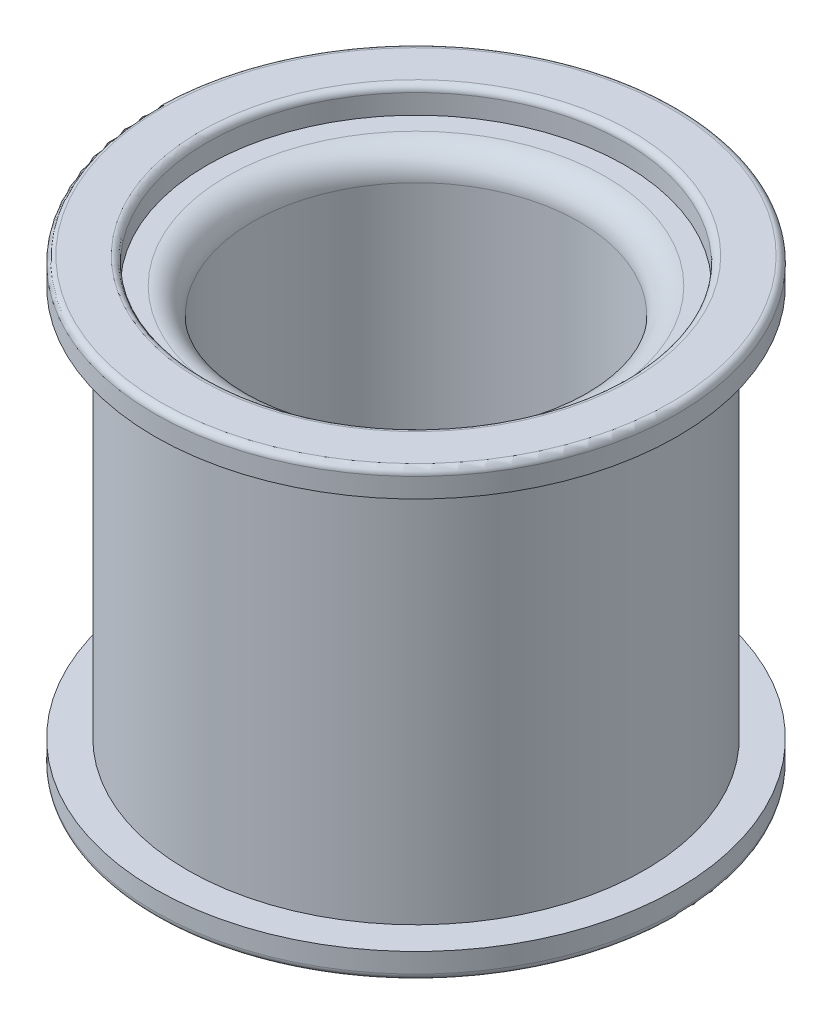
ISO-10303-21;
HEADER;
FILE_DESCRIPTION(('STEP AP214'),'2;1');
FILE_NAME('part.step','',(''),(''),'','','');
FILE_SCHEMA(('AUTOMOTIVE_DESIGN { 1 0 10303 214 1 1 1 1 }'));
ENDSEC;
DATA;
#1=APPLICATION_CONTEXT('core data for automotive mechanical design processes');
#2=APPLICATION_PROTOCOL_DEFINITION('international standard','automotive_design',2000,#1);
#3=PRODUCT_CONTEXT('',#1,'mechanical');
#4=PRODUCT('Part','Part','',(#3));
#5=PRODUCT_RELATED_PRODUCT_CATEGORY('part','',(#4));
#6=PRODUCT_DEFINITION_FORMATION('','',#4);
#7=PRODUCT_DEFINITION_CONTEXT('part definition',#1,'design');
#8=PRODUCT_DEFINITION('design','',#6,#7);
#9=PRODUCT_DEFINITION_SHAPE('','',#8);
#10=(LENGTH_UNIT() NAMED_UNIT(*) SI_UNIT(.MILLI.,.METRE.));
#11=(NAMED_UNIT(*) PLANE_ANGLE_UNIT() SI_UNIT($,.RADIAN.));
#12=(NAMED_UNIT(*) SI_UNIT($,.STERADIAN.) SOLID_ANGLE_UNIT());
#13=UNCERTAINTY_MEASURE_WITH_UNIT(LENGTH_MEASURE(1.E-05),#10,'distance_accuracy_value','');
#14=(GEOMETRIC_REPRESENTATION_CONTEXT(3) GLOBAL_UNCERTAINTY_ASSIGNED_CONTEXT((#13)) GLOBAL_UNIT_ASSIGNED_CONTEXT((#10,
#11,#12)) REPRESENTATION_CONTEXT('',''));
#15=CARTESIAN_POINT('',(0.,0.,0.));
#16=DIRECTION('',(0.,0.,1.));
#17=DIRECTION('',(1.,0.,0.));
#18=AXIS2_PLACEMENT_3D('',#15,#16,#17);
#19=CARTESIAN_POINT('',(0.,-17.,0.));
#20=DIRECTION('',(0.,-1.,0.));
#21=DIRECTION('',(0.,0.,-1.));
#22=AXIS2_PLACEMENT_3D('',#19,#20,#21);
#23=PLANE('',#22);
#24=CARTESIAN_POINT('',(0.,-17.,0.));
#25=DIRECTION('',(0.,-1.,0.));
#26=DIRECTION('',(0.,0.,-1.));
#27=AXIS2_PLACEMENT_3D('',#24,#25,#26);
#28=CIRCLE('',#27,19.5);
#29=CARTESIAN_POINT('',(0.,-17.,-19.5));
#30=VERTEX_POINT('',#29);
#31=EDGE_CURVE('E57',#30,#30,#28,.T.);
#32=ORIENTED_EDGE('',*,*,#31,.T.);
#33=EDGE_LOOP('',(#32));
#34=FACE_BOUND('',#33,.T.);
#35=CARTESIAN_POINT('',(0.,-17.,0.));
#36=DIRECTION('',(0.,-1.,0.));
#37=DIRECTION('',(0.,0.,-1.));
#38=AXIS2_PLACEMENT_3D('',#35,#36,#37);
#39=CIRCLE('',#38,16.5);
#40=CARTESIAN_POINT('',(0.,-17.,-16.5));
#41=VERTEX_POINT('',#40);
#42=EDGE_CURVE('E61',#41,#41,#39,.F.);
#43=ORIENTED_EDGE('',*,*,#42,.T.);
#44=EDGE_LOOP('',(#43));
#45=FACE_BOUND('',#44,.T.);
#46=ADVANCED_FACE('F46',(#34,#45),#23,.T.);
#47=CARTESIAN_POINT('',(0.,-15.,0.));
#48=DIRECTION('',(0.,-1.,0.));
#49=DIRECTION('',(0.,0.,-1.));
#50=AXIS2_PLACEMENT_3D('',#47,#48,#49);
#51=PLANE('',#50);
#52=CARTESIAN_POINT('',(0.,-15.,0.));
#53=DIRECTION('',(0.,-1.,0.));
#54=DIRECTION('',(0.,0.,-1.));
#55=AXIS2_PLACEMENT_3D('',#52,#53,#54);
#56=CIRCLE('',#55,20.);
#57=CARTESIAN_POINT('',(0.,-15.,-20.));
#58=VERTEX_POINT('',#57);
#59=EDGE_CURVE('E66',#58,#58,#56,.T.);
#60=ORIENTED_EDGE('',*,*,#59,.F.);
#61=EDGE_LOOP('',(#60));
#62=FACE_BOUND('',#61,.T.);
#63=CARTESIAN_POINT('',(0.,-15.,0.));
#64=DIRECTION('',(0.,-1.,0.));
#65=DIRECTION('',(0.,0.,-1.));
#66=AXIS2_PLACEMENT_3D('',#63,#64,#65);
#67=CIRCLE('',#66,16.);
#68=CARTESIAN_POINT('',(0.,-15.,-16.));
#69=VERTEX_POINT('',#68);
#70=EDGE_CURVE('E69',#69,#69,#67,.T.);
#71=ORIENTED_EDGE('',*,*,#70,.T.);
#72=EDGE_LOOP('',(#71));
#73=FACE_BOUND('',#72,.T.);
#74=ADVANCED_FACE('F73',(#62,#73),#51,.F.);
#75=CARTESIAN_POINT('',(0.,-17.,0.));
#76=DIRECTION('',(0.,1.,0.));
#77=DIRECTION('',(0.,0.,1.));
#78=AXIS2_PLACEMENT_3D('',#75,#76,#77);
#79=CYLINDRICAL_SURFACE('',#78,20.);
#80=CARTESIAN_POINT('',(0.,-16.5,0.));
#81=DIRECTION('',(0.,-1.,0.));
#82=DIRECTION('',(0.,0.,-1.));
#83=AXIS2_PLACEMENT_3D('',#80,#81,#82);
#84=CIRCLE('',#83,20.);
#85=CARTESIAN_POINT('',(0.,-16.5,-20.));
#86=VERTEX_POINT('',#85);
#87=EDGE_CURVE('E53',#86,#86,#84,.F.);
#88=ORIENTED_EDGE('',*,*,#87,.T.);
#89=EDGE_LOOP('',(#88));
#90=FACE_BOUND('',#89,.T.);
#91=ORIENTED_EDGE('',*,*,#59,.T.);
#92=EDGE_LOOP('',(#91));
#93=FACE_BOUND('',#92,.T.);
#94=ADVANCED_FACE('F78',(#90,#93),#79,.T.);
#95=CARTESIAN_POINT('',(0.,-17.,0.));
#96=DIRECTION('',(0.,1.,0.));
#97=DIRECTION('',(0.,0.,1.));
#98=AXIS2_PLACEMENT_3D('',#95,#96,#97);
#99=CYLINDRICAL_SURFACE('',#98,16.);
#100=CARTESIAN_POINT('',(0.,-16.5,0.));
#101=DIRECTION('',(0.,-1.,0.));
#102=DIRECTION('',(0.,0.,-1.));
#103=AXIS2_PLACEMENT_3D('',#100,#101,#102);
#104=CIRCLE('',#103,16.);
#105=CARTESIAN_POINT('',(0.,-16.5,-16.));
#106=VERTEX_POINT('',#105);
#107=EDGE_CURVE('E11',#106,#106,#104,.T.);
#108=ORIENTED_EDGE('',*,*,#107,.T.);
#109=EDGE_LOOP('',(#108));
#110=FACE_BOUND('',#109,.T.);
#111=ORIENTED_EDGE('',*,*,#70,.F.);
#112=EDGE_LOOP('',(#111));
#113=FACE_BOUND('',#112,.T.);
#114=ADVANCED_FACE('F75',(#110,#113),#99,.F.);
#115=CARTESIAN_POINT('',(0.,-16.5,0.));
#116=DIRECTION('',(0.,-1.,0.));
#117=DIRECTION('',(0.,0.,-1.));
#118=AXIS2_PLACEMENT_3D('',#115,#116,#117);
#119=TOROIDAL_SURFACE('',#118,19.5,0.5);
#120=ORIENTED_EDGE('',*,*,#87,.F.);
#121=EDGE_LOOP('',(#120));
#122=FACE_BOUND('',#121,.T.);
#123=ORIENTED_EDGE('',*,*,#31,.F.);
#124=EDGE_LOOP('',(#123));
#125=FACE_BOUND('',#124,.T.);
#126=ADVANCED_FACE('F77',(#122,#125),#119,.T.);
#127=CARTESIAN_POINT('',(0.,-16.5,0.));
#128=DIRECTION('',(0.,-1.,0.));
#129=DIRECTION('',(0.,0.,-1.));
#130=AXIS2_PLACEMENT_3D('',#127,#128,#129);
#131=TOROIDAL_SURFACE('',#130,16.5,0.5);
#132=ORIENTED_EDGE('',*,*,#42,.F.);
#133=EDGE_LOOP('',(#132));
#134=FACE_BOUND('',#133,.T.);
#135=ORIENTED_EDGE('',*,*,#107,.F.);
#136=EDGE_LOOP('',(#135));
#137=FACE_BOUND('',#136,.T.);
#138=ADVANCED_FACE('F48',(#134,#137),#131,.T.);
#139=CLOSED_SHELL('',(#46,#74,#94,#114,#126,#138));
#140=MANIFOLD_SOLID_BREP('B2',#139);
#141=CARTESIAN_POINT('',(0.,17.,0.));
#142=DIRECTION('',(0.,1.,0.));
#143=DIRECTION('',(0.,0.,1.));
#144=AXIS2_PLACEMENT_3D('',#141,#142,#143);
#145=PLANE('',#144);
#146=CARTESIAN_POINT('',(0.,17.,0.));
#147=DIRECTION('',(0.,1.,0.));
#148=DIRECTION('',(0.,0.,1.));
#149=AXIS2_PLACEMENT_3D('',#146,#147,#148);
#150=CIRCLE('',#149,19.5);
#151=CARTESIAN_POINT('',(0.,17.,19.5));
#152=VERTEX_POINT('',#151);
#153=EDGE_CURVE('E156',#152,#152,#150,.T.);
#154=ORIENTED_EDGE('',*,*,#153,.T.);
#155=EDGE_LOOP('',(#154));
#156=FACE_BOUND('',#155,.T.);
#157=CARTESIAN_POINT('',(0.,17.,0.));
#158=DIRECTION('',(0.,1.,0.));
#159=DIRECTION('',(0.,0.,1.));
#160=AXIS2_PLACEMENT_3D('',#157,#158,#159);
#161=CIRCLE('',#160,16.5);
#162=CARTESIAN_POINT('',(0.,17.,16.5));
#163=VERTEX_POINT('',#162);
#164=EDGE_CURVE('E160',#163,#163,#161,.F.);
#165=ORIENTED_EDGE('',*,*,#164,.T.);
#166=EDGE_LOOP('',(#165));
#167=FACE_BOUND('',#166,.T.);
#168=ADVANCED_FACE('F145',(#156,#167),#145,.T.);
#169=CARTESIAN_POINT('',(0.,15.,0.));
#170=DIRECTION('',(0.,1.,0.));
#171=DIRECTION('',(0.,0.,1.));
#172=AXIS2_PLACEMENT_3D('',#169,#170,#171);
#173=PLANE('',#172);
#174=CARTESIAN_POINT('',(0.,15.,0.));
#175=DIRECTION('',(0.,1.,0.));
#176=DIRECTION('',(0.,0.,1.));
#177=AXIS2_PLACEMENT_3D('',#174,#175,#176);
#178=CIRCLE('',#177,20.);
#179=CARTESIAN_POINT('',(0.,15.,20.));
#180=VERTEX_POINT('',#179);
#181=EDGE_CURVE('E165',#180,#180,#178,.T.);
#182=ORIENTED_EDGE('',*,*,#181,.F.);
#183=EDGE_LOOP('',(#182));
#184=FACE_BOUND('',#183,.T.);
#185=CARTESIAN_POINT('',(0.,15.,0.));
#186=DIRECTION('',(0.,1.,0.));
#187=DIRECTION('',(0.,0.,1.));
#188=AXIS2_PLACEMENT_3D('',#185,#186,#187);
#189=CIRCLE('',#188,16.);
#190=CARTESIAN_POINT('',(0.,15.,16.));
#191=VERTEX_POINT('',#190);
#192=EDGE_CURVE('E168',#191,#191,#189,.T.);
#193=ORIENTED_EDGE('',*,*,#192,.T.);
#194=EDGE_LOOP('',(#193));
#195=FACE_BOUND('',#194,.T.);
#196=ADVANCED_FACE('F172',(#184,#195),#173,.F.);
#197=CARTESIAN_POINT('',(0.,17.,0.));
#198=DIRECTION('',(0.,-1.,0.));
#199=DIRECTION('',(0.,0.,-1.));
#200=AXIS2_PLACEMENT_3D('',#197,#198,#199);
#201=CYLINDRICAL_SURFACE('',#200,20.);
#202=CARTESIAN_POINT('',(0.,16.5,0.));
#203=DIRECTION('',(0.,1.,0.));
#204=DIRECTION('',(0.,0.,1.));
#205=AXIS2_PLACEMENT_3D('',#202,#203,#204);
#206=CIRCLE('',#205,20.);
#207=CARTESIAN_POINT('',(0.,16.5,20.));
#208=VERTEX_POINT('',#207);
#209=EDGE_CURVE('E152',#208,#208,#206,.F.);
#210=ORIENTED_EDGE('',*,*,#209,.T.);
#211=EDGE_LOOP('',(#210));
#212=FACE_BOUND('',#211,.T.);
#213=ORIENTED_EDGE('',*,*,#181,.T.);
#214=EDGE_LOOP('',(#213));
#215=FACE_BOUND('',#214,.T.);
#216=ADVANCED_FACE('F177',(#212,#215),#201,.T.);
#217=CARTESIAN_POINT('',(0.,17.,0.));
#218=DIRECTION('',(0.,-1.,0.));
#219=DIRECTION('',(0.,0.,-1.));
#220=AXIS2_PLACEMENT_3D('',#217,#218,#219);
#221=CYLINDRICAL_SURFACE('',#220,16.);
#222=CARTESIAN_POINT('',(0.,16.5,0.));
#223=DIRECTION('',(0.,1.,0.));
#224=DIRECTION('',(0.,0.,1.));
#225=AXIS2_PLACEMENT_3D('',#222,#223,#224);
#226=CIRCLE('',#225,16.);
#227=CARTESIAN_POINT('',(0.,16.5,16.));
#228=VERTEX_POINT('',#227);
#229=EDGE_CURVE('E45',#228,#228,#226,.T.);
#230=ORIENTED_EDGE('',*,*,#229,.T.);
#231=EDGE_LOOP('',(#230));
#232=FACE_BOUND('',#231,.T.);
#233=ORIENTED_EDGE('',*,*,#192,.F.);
#234=EDGE_LOOP('',(#233));
#235=FACE_BOUND('',#234,.T.);
#236=ADVANCED_FACE('F174',(#232,#235),#221,.F.);
#237=CARTESIAN_POINT('',(0.,16.5,0.));
#238=DIRECTION('',(0.,1.,0.));
#239=DIRECTION('',(0.,0.,1.));
#240=AXIS2_PLACEMENT_3D('',#237,#238,#239);
#241=TOROIDAL_SURFACE('',#240,19.5,0.5);
#242=ORIENTED_EDGE('',*,*,#209,.F.);
#243=EDGE_LOOP('',(#242));
#244=FACE_BOUND('',#243,.T.);
#245=ORIENTED_EDGE('',*,*,#153,.F.);
#246=EDGE_LOOP('',(#245));
#247=FACE_BOUND('',#246,.T.);
#248=ADVANCED_FACE('F176',(#244,#247),#241,.T.);
#249=CARTESIAN_POINT('',(0.,16.5,0.));
#250=DIRECTION('',(0.,1.,0.));
#251=DIRECTION('',(0.,0.,1.));
#252=AXIS2_PLACEMENT_3D('',#249,#250,#251);
#253=TOROIDAL_SURFACE('',#252,16.5,0.5);
#254=ORIENTED_EDGE('',*,*,#164,.F.);
#255=EDGE_LOOP('',(#254));
#256=FACE_BOUND('',#255,.T.);
#257=ORIENTED_EDGE('',*,*,#229,.F.);
#258=EDGE_LOOP('',(#257));
#259=FACE_BOUND('',#258,.T.);
#260=ADVANCED_FACE('F147',(#256,#259),#253,.T.);
#261=CLOSED_SHELL('',(#168,#196,#216,#236,#248,#260));
#262=MANIFOLD_SOLID_BREP('B6',#261);
#263=CARTESIAN_POINT('',(0.,15.,0.));
#264=DIRECTION('',(0.,1.,0.));
#265=DIRECTION('',(0.,0.,1.));
#266=AXIS2_PLACEMENT_3D('',#263,#264,#265);
#267=PLANE('',#266);
#268=CARTESIAN_POINT('',(0.,15.,0.));
#269=DIRECTION('',(0.,1.,0.));
#270=DIRECTION('',(0.,0.,1.));
#271=AXIS2_PLACEMENT_3D('',#268,#269,#270);
#272=CIRCLE('',#271,14.5);
#273=CARTESIAN_POINT('',(0.,15.,14.5));
#274=VERTEX_POINT('',#273);
#275=EDGE_CURVE('E250',#274,#274,#272,.F.);
#276=ORIENTED_EDGE('',*,*,#275,.T.);
#277=EDGE_LOOP('',(#276));
#278=FACE_BOUND('',#277,.T.);
#279=CARTESIAN_POINT('',(0.,15.,0.));
#280=DIRECTION('',(0.,1.,0.));
#281=DIRECTION('',(0.,0.,1.));
#282=AXIS2_PLACEMENT_3D('',#279,#280,#281);
#283=CIRCLE('',#282,17.5);
#284=CARTESIAN_POINT('',(0.,15.,17.5));
#285=VERTEX_POINT('',#284);
#286=EDGE_CURVE('E261',#285,#285,#283,.T.);
#287=ORIENTED_EDGE('',*,*,#286,.T.);
#288=EDGE_LOOP('',(#287));
#289=FACE_BOUND('',#288,.T.);
#290=ADVANCED_FACE('F237',(#278,#289),#267,.T.);
#291=CARTESIAN_POINT('',(0.,15.,0.));
#292=DIRECTION('',(0.,-1.,0.));
#293=DIRECTION('',(0.,0.,-1.));
#294=AXIS2_PLACEMENT_3D('',#291,#292,#293);
#295=CYLINDRICAL_SURFACE('',#294,17.5);
#296=ORIENTED_EDGE('',*,*,#286,.F.);
#297=EDGE_LOOP('',(#296));
#298=FACE_BOUND('',#297,.T.);
#299=CARTESIAN_POINT('',(0.,-15.,0.));
#300=DIRECTION('',(0.,1.,0.));
#301=DIRECTION('',(0.,0.,1.));
#302=AXIS2_PLACEMENT_3D('',#299,#300,#301);
#303=CIRCLE('',#302,17.5);
#304=CARTESIAN_POINT('',(0.,-15.,17.5));
#305=VERTEX_POINT('',#304);
#306=EDGE_CURVE('E265',#305,#305,#303,.T.);
#307=ORIENTED_EDGE('',*,*,#306,.T.);
#308=EDGE_LOOP('',(#307));
#309=FACE_BOUND('',#308,.T.);
#310=ADVANCED_FACE('F270',(#298,#309),#295,.T.);
#311=CARTESIAN_POINT('',(0.,15.,0.));
#312=DIRECTION('',(0.,-1.,0.));
#313=DIRECTION('',(0.,0.,-1.));
#314=AXIS2_PLACEMENT_3D('',#311,#312,#313);
#315=CYLINDRICAL_SURFACE('',#314,12.5);
#316=CARTESIAN_POINT('',(0.,-13.,0.));
#317=DIRECTION('',(0.,-1.,0.));
#318=DIRECTION('',(0.,0.,-1.));
#319=AXIS2_PLACEMENT_3D('',#316,#317,#318);
#320=CIRCLE('',#319,12.5);
#321=CARTESIAN_POINT('',(0.,-13.,-12.5));
#322=VERTEX_POINT('',#321);
#323=EDGE_CURVE('E144',#322,#322,#320,.T.);
#324=ORIENTED_EDGE('',*,*,#323,.T.);
#325=EDGE_LOOP('',(#324));
#326=FACE_BOUND('',#325,.T.);
#327=CARTESIAN_POINT('',(0.,13.,0.));
#328=DIRECTION('',(0.,1.,0.));
#329=DIRECTION('',(0.,0.,1.));
#330=AXIS2_PLACEMENT_3D('',#327,#328,#329);
#331=CIRCLE('',#330,12.5);
#332=CARTESIAN_POINT('',(0.,13.,12.5));
#333=VERTEX_POINT('',#332);
#334=EDGE_CURVE('E255',#333,#333,#331,.T.);
#335=ORIENTED_EDGE('',*,*,#334,.T.);
#336=EDGE_LOOP('',(#335));
#337=FACE_BOUND('',#336,.T.);
#338=ADVANCED_FACE('F281',(#326,#337),#315,.F.);
#339=CARTESIAN_POINT('',(0.,13.,0.));
#340=DIRECTION('',(0.,1.,0.));
#341=DIRECTION('',(0.,0.,1.));
#342=AXIS2_PLACEMENT_3D('',#339,#340,#341);
#343=TOROIDAL_SURFACE('',#342,14.5,2.);
#344=ORIENTED_EDGE('',*,*,#275,.F.);
#345=EDGE_LOOP('',(#344));
#346=FACE_BOUND('',#345,.T.);
#347=ORIENTED_EDGE('',*,*,#334,.F.);
#348=EDGE_LOOP('',(#347));
#349=FACE_BOUND('',#348,.T.);
#350=ADVANCED_FACE('F274',(#346,#349),#343,.T.);
#351=CARTESIAN_POINT('',(0.,-15.,0.));
#352=DIRECTION('',(0.,-1.,0.));
#353=DIRECTION('',(0.,0.,1.));
#354=AXIS2_PLACEMENT_3D('',#351,#352,#353);
#355=PLANE('',#354);
#356=CARTESIAN_POINT('',(0.,-15.,0.));
#357=DIRECTION('',(0.,-1.,0.));
#358=DIRECTION('',(0.,0.,-1.));
#359=AXIS2_PLACEMENT_3D('',#356,#357,#358);
#360=CIRCLE('',#359,14.5);
#361=CARTESIAN_POINT('',(0.,-15.,-14.5));
#362=VERTEX_POINT('',#361);
#363=EDGE_CURVE('E245',#362,#362,#360,.F.);
#364=ORIENTED_EDGE('',*,*,#363,.T.);
#365=EDGE_LOOP('',(#364));
#366=FACE_BOUND('',#365,.T.);
#367=ORIENTED_EDGE('',*,*,#306,.F.);
#368=EDGE_LOOP('',(#367));
#369=FACE_BOUND('',#368,.T.);
#370=ADVANCED_FACE('F272',(#366,#369),#355,.T.);
#371=CARTESIAN_POINT('',(0.,-13.,0.));
#372=DIRECTION('',(0.,-1.,0.));
#373=DIRECTION('',(0.,0.,-1.));
#374=AXIS2_PLACEMENT_3D('',#371,#372,#373);
#375=TOROIDAL_SURFACE('',#374,14.5,2.);
#376=ORIENTED_EDGE('',*,*,#323,.F.);
#377=EDGE_LOOP('',(#376));
#378=FACE_BOUND('',#377,.T.);
#379=ORIENTED_EDGE('',*,*,#363,.F.);
#380=EDGE_LOOP('',(#379));
#381=FACE_BOUND('',#380,.T.);
#382=ADVANCED_FACE('F239',(#378,#381),#375,.T.);
#383=CLOSED_SHELL('',(#290,#310,#338,#350,#370,#382));
#384=MANIFOLD_SOLID_BREP('B40',#383);
#385=ADVANCED_BREP_SHAPE_REPRESENTATION('',(#18,#140,#262,#384),#14);
#386=SHAPE_DEFINITION_REPRESENTATION(#9,#385);
ENDSEC;
END-ISO-10303-21;
